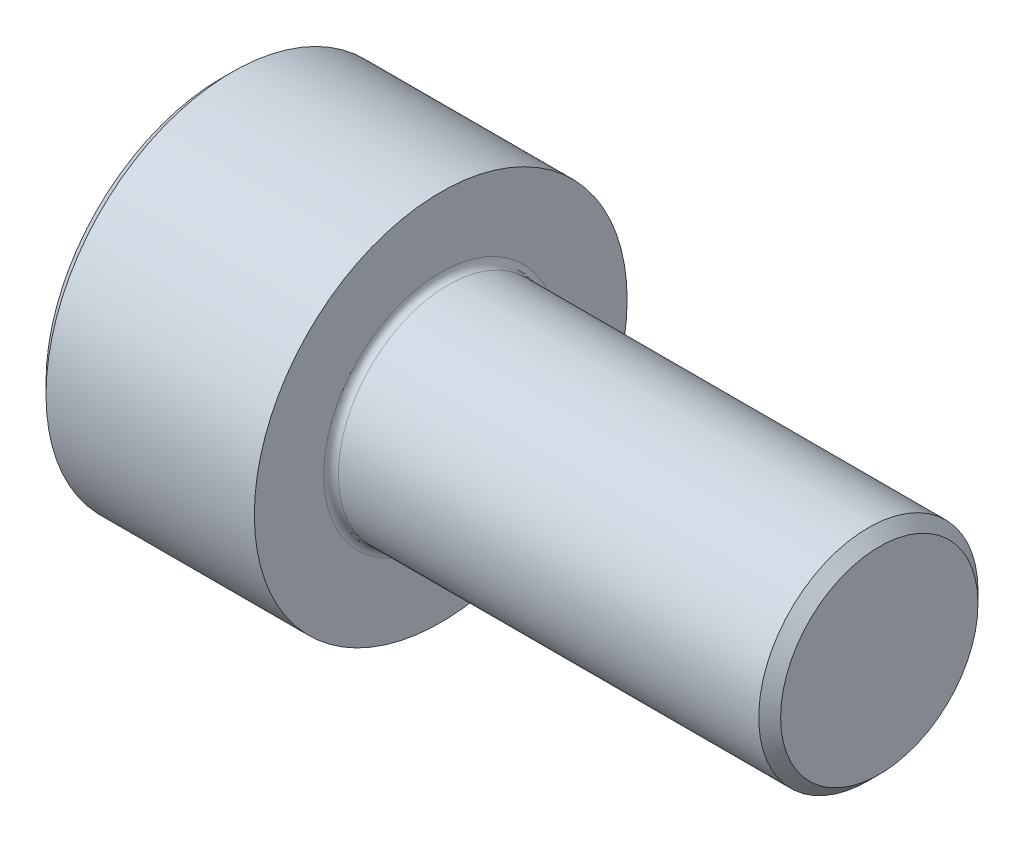
ISO-10303-21;
HEADER;
FILE_DESCRIPTION(('STEP AP214'),'2;1');
FILE_NAME('part.step','',(''),(''),'','','');
FILE_SCHEMA(('AUTOMOTIVE_DESIGN { 1 0 10303 214 1 1 1 1 }'));
ENDSEC;
DATA;
#1=APPLICATION_CONTEXT('core data for automotive mechanical design processes');
#2=APPLICATION_PROTOCOL_DEFINITION('international standard','automotive_design',2000,#1);
#3=PRODUCT_CONTEXT('',#1,'mechanical');
#4=PRODUCT('Part','Part','',(#3));
#5=PRODUCT_RELATED_PRODUCT_CATEGORY('part','',(#4));
#6=PRODUCT_DEFINITION_FORMATION('','',#4);
#7=PRODUCT_DEFINITION_CONTEXT('part definition',#1,'design');
#8=PRODUCT_DEFINITION('design','',#6,#7);
#9=PRODUCT_DEFINITION_SHAPE('','',#8);
#10=(LENGTH_UNIT() NAMED_UNIT(*) SI_UNIT(.MILLI.,.METRE.));
#11=(NAMED_UNIT(*) PLANE_ANGLE_UNIT() SI_UNIT($,.RADIAN.));
#12=(NAMED_UNIT(*) SI_UNIT($,.STERADIAN.) SOLID_ANGLE_UNIT());
#13=UNCERTAINTY_MEASURE_WITH_UNIT(LENGTH_MEASURE(1.E-05),#10,'distance_accuracy_value','');
#14=(GEOMETRIC_REPRESENTATION_CONTEXT(3) GLOBAL_UNCERTAINTY_ASSIGNED_CONTEXT((#13)) GLOBAL_UNIT_ASSIGNED_CONTEXT((#10,
#11,#12)) REPRESENTATION_CONTEXT('',''));
#15=CARTESIAN_POINT('',(0.,0.,0.));
#16=DIRECTION('',(0.,0.,1.));
#17=DIRECTION('',(1.,0.,0.));
#18=AXIS2_PLACEMENT_3D('',#15,#16,#17);
#19=CARTESIAN_POINT('',(6.,0.,0.));
#20=DIRECTION('',(-1.,0.,0.));
#21=DIRECTION('',(0.,0.,1.));
#22=AXIS2_PLACEMENT_3D('',#19,#20,#21);
#23=CYLINDRICAL_SURFACE('',#22,5.1);
#24=CARTESIAN_POINT('',(0.300000000000002,0.,0.));
#25=DIRECTION('',(-1.,0.,0.));
#26=DIRECTION('',(0.,0.,1.));
#27=AXIS2_PLACEMENT_3D('',#24,#25,#26);
#28=CIRCLE('',#27,5.1);
#29=CARTESIAN_POINT('',(0.300000000000002,0.,5.1));
#30=VERTEX_POINT('',#29);
#31=EDGE_CURVE('E178',#30,#30,#28,.F.);
#32=ORIENTED_EDGE('',*,*,#31,.T.);
#33=EDGE_LOOP('',(#32));
#34=FACE_BOUND('',#33,.T.);
#35=CARTESIAN_POINT('',(6.,0.,0.));
#36=DIRECTION('',(-1.,0.,0.));
#37=DIRECTION('',(0.,0.,1.));
#38=AXIS2_PLACEMENT_3D('',#35,#36,#37);
#39=CIRCLE('',#38,5.1);
#40=CARTESIAN_POINT('',(6.,0.,5.1));
#41=VERTEX_POINT('',#40);
#42=EDGE_CURVE('E160',#41,#41,#39,.T.);
#43=ORIENTED_EDGE('',*,*,#42,.T.);
#44=EDGE_LOOP('',(#43));
#45=FACE_BOUND('',#44,.T.);
#46=ADVANCED_FACE('F44',(#34,#45),#23,.T.);
#47=CARTESIAN_POINT('',(6.,5.1,0.));
#48=DIRECTION('',(1.,0.,0.));
#49=DIRECTION('',(0.,0.,-1.));
#50=AXIS2_PLACEMENT_3D('',#47,#48,#49);
#51=PLANE('',#50);
#52=CARTESIAN_POINT('',(6.,0.,0.));
#53=DIRECTION('',(1.,0.,0.));
#54=DIRECTION('',(0.,0.,-1.));
#55=AXIS2_PLACEMENT_3D('',#52,#53,#54);
#56=CIRCLE('',#55,3.2);
#57=CARTESIAN_POINT('',(6.,0.,-3.2));
#58=VERTEX_POINT('',#57);
#59=EDGE_CURVE('E59',#58,#58,#56,.F.);
#60=ORIENTED_EDGE('',*,*,#59,.T.);
#61=EDGE_LOOP('',(#60));
#62=FACE_BOUND('',#61,.T.);
#63=ORIENTED_EDGE('',*,*,#42,.F.);
#64=EDGE_LOOP('',(#63));
#65=FACE_BOUND('',#64,.T.);
#66=ADVANCED_FACE('F190',(#62,#65),#51,.T.);
#67=CARTESIAN_POINT('',(0.,0.,0.));
#68=DIRECTION('',(-1.,0.,0.));
#69=DIRECTION('',(0.,0.,1.));
#70=AXIS2_PLACEMENT_3D('',#67,#68,#69);
#71=PLANE('',#70);
#72=CARTESIAN_POINT('',(0.,0.,0.));
#73=DIRECTION('',(-1.,0.,0.));
#74=DIRECTION('',(0.,0.,1.));
#75=AXIS2_PLACEMENT_3D('',#72,#73,#74);
#76=CIRCLE('',#75,2.945);
#77=CARTESIAN_POINT('',(0.,0.,2.945));
#78=VERTEX_POINT('',#77);
#79=EDGE_CURVE('E240',#78,#78,#76,.T.);
#80=ORIENTED_EDGE('',*,*,#79,.F.);
#81=EDGE_LOOP('',(#80));
#82=FACE_BOUND('',#81,.T.);
#83=CARTESIAN_POINT('',(0.,0.,0.));
#84=DIRECTION('',(-1.,0.,0.));
#85=DIRECTION('',(0.,0.,1.));
#86=AXIS2_PLACEMENT_3D('',#83,#84,#85);
#87=CIRCLE('',#86,4.8);
#88=CARTESIAN_POINT('',(0.,0.,4.8));
#89=VERTEX_POINT('',#88);
#90=EDGE_CURVE('E174',#89,#89,#87,.T.);
#91=ORIENTED_EDGE('',*,*,#90,.T.);
#92=EDGE_LOOP('',(#91));
#93=FACE_BOUND('',#92,.T.);
#94=ADVANCED_FACE('F202',(#82,#93),#71,.T.);
#95=CARTESIAN_POINT('',(18.,0.,0.));
#96=DIRECTION('',(-1.,0.,0.));
#97=DIRECTION('',(0.,0.,1.));
#98=AXIS2_PLACEMENT_3D('',#95,#96,#97);
#99=CYLINDRICAL_SURFACE('',#98,3.);
#100=CARTESIAN_POINT('',(6.2,0.,0.));
#101=DIRECTION('',(1.,0.,0.));
#102=DIRECTION('',(0.,0.,-1.));
#103=AXIS2_PLACEMENT_3D('',#100,#101,#102);
#104=CIRCLE('',#103,3.);
#105=CARTESIAN_POINT('',(6.2,0.,-3.));
#106=VERTEX_POINT('',#105);
#107=EDGE_CURVE('E182',#106,#106,#104,.T.);
#108=ORIENTED_EDGE('',*,*,#107,.T.);
#109=EDGE_LOOP('',(#108));
#110=FACE_BOUND('',#109,.T.);
#111=CARTESIAN_POINT('',(17.7,0.,0.));
#112=DIRECTION('',(1.,0.,0.));
#113=DIRECTION('',(0.,0.,-1.));
#114=AXIS2_PLACEMENT_3D('',#111,#112,#113);
#115=CIRCLE('',#114,3.);
#116=CARTESIAN_POINT('',(17.7,0.,-3.));
#117=VERTEX_POINT('',#116);
#118=EDGE_CURVE('E169',#117,#117,#115,.F.);
#119=ORIENTED_EDGE('',*,*,#118,.T.);
#120=EDGE_LOOP('',(#119));
#121=FACE_BOUND('',#120,.T.);
#122=ADVANCED_FACE('F198',(#110,#121),#99,.T.);
#123=CARTESIAN_POINT('',(18.,0.,0.));
#124=DIRECTION('',(1.,0.,0.));
#125=DIRECTION('',(0.,0.,-1.));
#126=AXIS2_PLACEMENT_3D('',#123,#124,#125);
#127=PLANE('',#126);
#128=CARTESIAN_POINT('',(18.,0.,0.));
#129=DIRECTION('',(1.,0.,0.));
#130=DIRECTION('',(0.,0.,-1.));
#131=AXIS2_PLACEMENT_3D('',#128,#129,#130);
#132=CIRCLE('',#131,2.7);
#133=CARTESIAN_POINT('',(18.,0.,-2.7));
#134=VERTEX_POINT('',#133);
#135=EDGE_CURVE('E165',#134,#134,#132,.T.);
#136=ORIENTED_EDGE('',*,*,#135,.T.);
#137=EDGE_LOOP('',(#136));
#138=FACE_BOUND('',#137,.T.);
#139=ADVANCED_FACE('F201',(#138),#127,.T.);
#140=CARTESIAN_POINT('',(18.,0.,0.));
#141=DIRECTION('',(-1.,0.,0.));
#142=DIRECTION('',(0.,0.,1.));
#143=AXIS2_PLACEMENT_3D('',#140,#141,#142);
#144=CONICAL_SURFACE('',#143,2.7,0.78539816339745);
#145=ORIENTED_EDGE('',*,*,#118,.F.);
#146=EDGE_LOOP('',(#145));
#147=FACE_BOUND('',#146,.T.);
#148=ORIENTED_EDGE('',*,*,#135,.F.);
#149=EDGE_LOOP('',(#148));
#150=FACE_BOUND('',#149,.T.);
#151=ADVANCED_FACE('F206',(#147,#150),#144,.T.);
#152=CARTESIAN_POINT('',(0.,0.,0.));
#153=DIRECTION('',(1.,0.,0.));
#154=DIRECTION('',(0.,0.,-1.));
#155=AXIS2_PLACEMENT_3D('',#152,#153,#154);
#156=CONICAL_SURFACE('',#155,4.8,0.785398163397445);
#157=ORIENTED_EDGE('',*,*,#31,.F.);
#158=EDGE_LOOP('',(#157));
#159=FACE_BOUND('',#158,.T.);
#160=ORIENTED_EDGE('',*,*,#90,.F.);
#161=EDGE_LOOP('',(#160));
#162=FACE_BOUND('',#161,.T.);
#163=ADVANCED_FACE('F195',(#159,#162),#156,.T.);
#164=CARTESIAN_POINT('',(6.2,0.,0.));
#165=DIRECTION('',(1.,0.,0.));
#166=DIRECTION('',(0.,0.,-1.));
#167=AXIS2_PLACEMENT_3D('',#164,#165,#166);
#168=TOROIDAL_SURFACE('',#167,3.2,0.2);
#169=ORIENTED_EDGE('',*,*,#59,.F.);
#170=EDGE_LOOP('',(#169));
#171=FACE_BOUND('',#170,.T.);
#172=ORIENTED_EDGE('',*,*,#107,.F.);
#173=EDGE_LOOP('',(#172));
#174=FACE_BOUND('',#173,.T.);
#175=ADVANCED_FACE('F46',(#171,#174),#168,.F.);
#176=CARTESIAN_POINT('',(1.70029654276345,0.,0.));
#177=DIRECTION('',(-1.,0.,0.));
#178=DIRECTION('',(0.,0.,1.));
#179=AXIS2_PLACEMENT_3D('',#176,#177,#178);
#180=CONICAL_SURFACE('',#179,0.,1.0471975511966);
#181=ORIENTED_EDGE('',*,*,#79,.T.);
#182=EDGE_LOOP('',(#181));
#183=FACE_BOUND('',#182,.T.);
#184=CARTESIAN_POINT('',(0.000229872175366299,2.94460184292093,-0.000199999999999841));
#185=CARTESIAN_POINT('',(0.037598527799728,2.87990372238667,0.111860431919559));
#186=CARTESIAN_POINT('',(0.071584200644194,2.81464713289884,0.224888160441135));
#187=CARTESIAN_POINT('',(0.130907091295653,2.68300392088697,0.45290089211726));
#188=CARTESIAN_POINT('',(0.156223321882847,2.61661495890253,0.567889947336069));
#189=CARTESIAN_POINT('',(0.195632486124268,2.4846598185806,0.796442954693535));
#190=CARTESIAN_POINT('',(0.209987695662893,2.41911394548053,0.909971737129315));
#191=CARTESIAN_POINT('',(0.227126154979493,2.28771371615578,1.13756361044599));
#192=CARTESIAN_POINT('',(0.229923595480082,2.22185983767203,1.25162587385531));
#193=CARTESIAN_POINT('',(0.224110119241172,2.09880371081117,1.46476533776095));
#194=CARTESIAN_POINT('',(0.216926609971056,2.04158305994987,1.56387441229489));
#195=CARTESIAN_POINT('',(0.194157184817385,1.92751455798909,1.76144685323423));
#196=CARTESIAN_POINT('',(0.178563487647654,1.87066710155663,1.85990953605631));
#197=CARTESIAN_POINT('',(0.139579696785724,1.75636333035744,2.05788947527003));
#198=CARTESIAN_POINT('',(0.116024319293374,1.69892148572534,2.15738166865331));
#199=CARTESIAN_POINT('',(0.0625625859029028,1.58489462646657,2.35488198231701));
#200=CARTESIAN_POINT('',(0.0326687951749982,1.52830815049912,2.4528926337139));
#201=CARTESIAN_POINT('',(0.000229872175367198,1.47212771637971,2.5502));
#202=B_SPLINE_CURVE_WITH_KNOTS('',3,(#184,#185,#186,#187,#188,#189,#190,#191,#192,#193,#194,
#195,#196,#197,#198,#199,#200,#201),.UNSPECIFIED.,.F.,.F.,(4,2,2,2,2,2,2,2,4),(0.,
0.40421122763369,0.809394175542334,1.20454855862244,1.59921762349791,1.94289011245202,
2.28688112141386,2.63850335588813,2.98943495034801),.UNSPECIFIED.);
#203=CARTESIAN_POINT('',(0.000296542763447859,2.94448637286709,0.));
#204=VERTEX_POINT('',#203);
#205=CARTESIAN_POINT('',(0.000296542763448576,1.47224318643355,2.55));
#206=VERTEX_POINT('',#205);
#207=EDGE_CURVE('E123',#204,#206,#202,.T.);
#208=ORIENTED_EDGE('',*,*,#207,.T.);
#209=CARTESIAN_POINT('',(-1.47484899769549,4.87259146751385,2.55));
#210=CARTESIAN_POINT('',(-1.41648166165182,4.75847328617427,2.55));
#211=CARTESIAN_POINT('',(-1.3584508479649,4.64418140763559,2.55));
#212=CARTESIAN_POINT('',(-1.24323009027991,4.41517179068526,2.55));
#213=CARTESIAN_POINT('',(-1.18604016418326,4.30045404327233,2.55));
#214=CARTESIAN_POINT('',(-1.07257438035036,4.07032208462447,2.55));
#215=CARTESIAN_POINT('',(-1.01630025665971,3.95490701685364,2.55));
#216=CARTESIAN_POINT('',(-0.904997025129718,3.72347505526788,2.55));
#217=CARTESIAN_POINT('',(-0.849967935476552,3.60745815269235,2.55));
#218=CARTESIAN_POINT('',(-0.738687224935464,3.36877341251939,2.55));
#219=CARTESIAN_POINT('',(-0.682516181725843,3.24606789662205,2.55));
#220=CARTESIAN_POINT('',(-0.572335768770349,2.9996911005209,2.55));
#221=CARTESIAN_POINT('',(-0.518326336906287,2.87601984819167,2.55));
#222=CARTESIAN_POINT('',(-0.413117941821226,2.62758289647777,2.55));
#223=CARTESIAN_POINT('',(-0.361917038751132,2.50281802333484,2.55));
#224=CARTESIAN_POINT('',(-0.26310393155866,2.25183291867401,2.55));
#225=CARTESIAN_POINT('',(-0.215492605547942,2.12561233970017,2.55));
#226=CARTESIAN_POINT('',(-0.116904477360082,1.84880230520432,2.55));
#227=CARTESIAN_POINT('',(-0.0668420529179473,1.6978818109477,2.55));
#228=CARTESIAN_POINT('',(0.0242806527338532,1.39338628644286,2.55));
#229=CARTESIAN_POINT('',(0.0653456833257317,1.2398127030735,2.55));
#230=CARTESIAN_POINT('',(0.134735280374326,0.932707548207137,2.55));
#231=CARTESIAN_POINT('',(0.163282863336434,0.779228452500968,2.55));
#232=CARTESIAN_POINT('',(0.195121536659108,0.547542325977293,2.55));
#233=CARTESIAN_POINT('',(0.203903693213269,0.470075790207209,2.55));
#234=CARTESIAN_POINT('',(0.217537764667609,0.314802075382786,2.55));
#235=CARTESIAN_POINT('',(0.222390252945671,0.236994947690502,2.55));
#236=CARTESIAN_POINT('',(0.22802291270262,0.0803147315579719,2.55));
#237=CARTESIAN_POINT('',(0.228754521003386,0.00143986825860558,2.55));
#238=CARTESIAN_POINT('',(0.225996296141731,-0.156230083236554,2.55));
#239=CARTESIAN_POINT('',(0.222506449125209,-0.235025171169688,2.55));
#240=CARTESIAN_POINT('',(0.205854624492048,-0.471007687663784,2.55));
#241=CARTESIAN_POINT('',(0.186510158289658,-0.627786337743065,2.55));
#242=CARTESIAN_POINT('',(0.133287319024384,-0.941901112470843,2.55));
#243=CARTESIAN_POINT('',(0.0991310864492806,-1.0991877624398,2.55));
#244=CARTESIAN_POINT('',(0.0196702729838235,-1.41088610410001,2.55));
#245=CARTESIAN_POINT('',(-0.0256368739949201,-1.56529712523093,2.55));
#246=CARTESIAN_POINT('',(-0.120424779152049,-1.85908383984755,2.55));
#247=CARTESIAN_POINT('',(-0.169273879242653,-1.9986674687844,2.55));
#248=CARTESIAN_POINT('',(-0.272107483202157,-2.27594397293141,2.55));
#249=CARTESIAN_POINT('',(-0.326093002031515,-2.41363646827513,2.55));
#250=CARTESIAN_POINT('',(-0.437938442919878,-2.68756852985751,2.55));
#251=CARTESIAN_POINT('',(-0.495801747180723,-2.82380670436804,2.55));
#252=CARTESIAN_POINT('',(-0.614424878596883,-3.09501779074027,2.55));
#253=CARTESIAN_POINT('',(-0.675184845718758,-3.22999064108373,2.55));
#254=CARTESIAN_POINT('',(-0.795625795555528,-3.4917459180872,2.55));
#255=CARTESIAN_POINT('',(-0.855191713287153,-3.61858149439616,2.55));
#256=CARTESIAN_POINT('',(-0.975894547973628,-3.87150571223176,2.55));
#257=CARTESIAN_POINT('',(-1.03703150898513,-3.99759433268931,2.55));
#258=CARTESIAN_POINT('',(-1.160378776672,-4.24879428314627,2.55));
#259=CARTESIAN_POINT('',(-1.22258549181428,-4.37390738071277,2.55));
#260=CARTESIAN_POINT('',(-1.34801235978549,-4.62361247945631,2.55));
#261=CARTESIAN_POINT('',(-1.41123243171126,-4.74820452124121,2.55));
#262=CARTESIAN_POINT('',(-1.47484899769549,-4.87259146751385,2.55));
#263=B_SPLINE_CURVE_WITH_KNOTS('',3,(#209,#210,#211,#212,#213,#214,#215,#216,#217,#218,#219,
#220,#221,#222,#223,#224,#225,#226,#227,#228,#229,#230,#231,#232,#233,#234,#235,#236,#237,#238,
#239,#240,#241,#242,#243,#244,#245,#246,#247,#248,#249,#250,#251,#252,#253,#254,#255,#256,#257,
#258,#259,#260,#261,#262),.UNSPECIFIED.,.F.,.F.,(4,2,2,2,2,2,2,2,2,2,2,2,2,2,2,2,2,2,2,2,2,2,2,
2,2,2,4),(0.,0.384536769578632,0.76908171364089,1.15428553221106,1.53949497381647,
1.94433219747402,2.34915777896561,2.75370013269541,3.15834112992183,3.63515445320083,
4.1117154752074,4.57940180494931,4.81320458962684,5.04697325399144,5.28349112970923,
5.52000978164074,5.99306509581475,6.47540693422917,6.95785987483154,7.40138788087398,
7.84500371114791,8.28901162934102,8.73304102375602,9.15340673889058,9.57378425520128,
9.99295308905535,10.4120886228657),.UNSPECIFIED.);
#264=CARTESIAN_POINT('',(0.000296542763448674,-1.47224318643355,2.55));
#265=VERTEX_POINT('',#264);
#266=EDGE_CURVE('E140',#206,#265,#263,.T.);
#267=ORIENTED_EDGE('',*,*,#266,.T.);
#268=CARTESIAN_POINT('',(0.000229872175366992,-1.47212771637971,2.5502));
#269=CARTESIAN_POINT('',(0.0375985277997286,-1.53682583691397,2.43813956808044));
#270=CARTESIAN_POINT('',(0.0715842006441946,-1.6020824264018,2.32511183955886));
#271=CARTESIAN_POINT('',(0.130907091295654,-1.73372563841367,2.09709910788274));
#272=CARTESIAN_POINT('',(0.156223321882848,-1.80011460039811,1.98211005266393));
#273=CARTESIAN_POINT('',(0.195632486124269,-1.93206974072004,1.75355704530646));
#274=CARTESIAN_POINT('',(0.209987695662893,-1.99761561382011,1.64002826287068));
#275=CARTESIAN_POINT('',(0.227126154979493,-2.12901584314486,1.41243638955401));
#276=CARTESIAN_POINT('',(0.229923595480083,-2.19486972162861,1.29837412614469));
#277=CARTESIAN_POINT('',(0.224110119241172,-2.31792584848947,1.08523466223905));
#278=CARTESIAN_POINT('',(0.216926609971057,-2.37514649935077,0.986125587705114));
#279=CARTESIAN_POINT('',(0.194157184817386,-2.48921500131155,0.788553146765766));
#280=CARTESIAN_POINT('',(0.178563487647654,-2.54606245774401,0.690090463943686));
#281=CARTESIAN_POINT('',(0.139579696785724,-2.6603662289432,0.492110524729967));
#282=CARTESIAN_POINT('',(0.116024319293374,-2.7178080735753,0.392618331346692));
#283=CARTESIAN_POINT('',(0.0625625859029027,-2.83183493283407,0.19511801768299));
#284=CARTESIAN_POINT('',(0.032668795174998,-2.88842140880151,0.0971073662861024));
#285=CARTESIAN_POINT('',(0.000229872175366889,-2.94460184292093,-0.000200000000000605));
#286=B_SPLINE_CURVE_WITH_KNOTS('',3,(#268,#269,#270,#271,#272,#273,#274,#275,#276,#277,#278,
#279,#280,#281,#282,#283,#284,#285),.UNSPECIFIED.,.F.,.F.,(4,2,2,2,2,2,2,2,4),(0.,
0.404211227633689,0.809394175542333,1.20454855862244,1.59921762349791,1.94289011245202,
2.28688112141386,2.63850335588813,2.98943495034801),.UNSPECIFIED.);
#287=CARTESIAN_POINT('',(0.000296542763448496,-2.94448637286709,0.));
#288=VERTEX_POINT('',#287);
#289=EDGE_CURVE('E272',#265,#288,#286,.T.);
#290=ORIENTED_EDGE('',*,*,#289,.T.);
#291=CARTESIAN_POINT('',(0.000229872175367005,-2.94460184292093,0.000199999999999544));
#292=CARTESIAN_POINT('',(0.0375985277997286,-2.87990372238667,-0.111860431919559));
#293=CARTESIAN_POINT('',(0.0715842006441947,-2.81464713289884,-0.224888160441135));
#294=CARTESIAN_POINT('',(0.130907091295654,-2.68300392088697,-0.452900892117259));
#295=CARTESIAN_POINT('',(0.156223321882848,-2.61661495890253,-0.567889947336069));
#296=CARTESIAN_POINT('',(0.195632486124269,-2.4846598185806,-0.796442954693535));
#297=CARTESIAN_POINT('',(0.209987695662893,-2.41911394548053,-0.909971737129315));
#298=CARTESIAN_POINT('',(0.227126154979493,-2.28771371615578,-1.13756361044599));
#299=CARTESIAN_POINT('',(0.229923595480083,-2.22185983767203,-1.25162587385531));
#300=CARTESIAN_POINT('',(0.224110119241172,-2.09880371081117,-1.46476533776095));
#301=CARTESIAN_POINT('',(0.216926609971056,-2.04158305994987,-1.56387441229489));
#302=CARTESIAN_POINT('',(0.194157184817385,-1.92751455798909,-1.76144685323423));
#303=CARTESIAN_POINT('',(0.178563487647654,-1.87066710155663,-1.85990953605631));
#304=CARTESIAN_POINT('',(0.139579696785724,-1.75636333035744,-2.05788947527003));
#305=CARTESIAN_POINT('',(0.116024319293373,-1.69892148572534,-2.15738166865331));
#306=CARTESIAN_POINT('',(0.0625625859029021,-1.58489462646657,-2.35488198231701));
#307=CARTESIAN_POINT('',(0.0326687951749973,-1.52830815049912,-2.4528926337139));
#308=CARTESIAN_POINT('',(0.000229872175366292,-1.47212771637971,-2.5502));
#309=B_SPLINE_CURVE_WITH_KNOTS('',3,(#291,#292,#293,#294,#295,#296,#297,#298,#299,#300,#301,
#302,#303,#304,#305,#306,#307,#308),.UNSPECIFIED.,.F.,.F.,(4,2,2,2,2,2,2,2,4),(0.,
0.40421122763369,0.809394175542334,1.20454855862244,1.59921762349791,1.94289011245202,
2.28688112141386,2.63850335588814,2.98943495034801),.UNSPECIFIED.);
#310=CARTESIAN_POINT('',(0.00029654276344784,-1.47224318643355,-2.55));
#311=VERTEX_POINT('',#310);
#312=EDGE_CURVE('E246',#288,#311,#309,.T.);
#313=ORIENTED_EDGE('',*,*,#312,.T.);
#314=CARTESIAN_POINT('',(-1.47484899769549,-4.87259146751385,-2.55));
#315=CARTESIAN_POINT('',(-1.41648166165182,-4.75847328617427,-2.55));
#316=CARTESIAN_POINT('',(-1.3584508479649,-4.64418140763558,-2.55));
#317=CARTESIAN_POINT('',(-1.24323009027991,-4.41517179068526,-2.55));
#318=CARTESIAN_POINT('',(-1.18604016418326,-4.30045404327233,-2.55));
#319=CARTESIAN_POINT('',(-1.07257438035036,-4.07032208462447,-2.55));
#320=CARTESIAN_POINT('',(-1.01630025665971,-3.95490701685364,-2.55));
#321=CARTESIAN_POINT('',(-0.904997025129717,-3.72347505526788,-2.55));
#322=CARTESIAN_POINT('',(-0.849967935476551,-3.60745815269235,-2.55));
#323=CARTESIAN_POINT('',(-0.738687224935463,-3.36877341251938,-2.55));
#324=CARTESIAN_POINT('',(-0.682516181725842,-3.24606789662205,-2.55));
#325=CARTESIAN_POINT('',(-0.572335768770349,-2.99969110052089,-2.55));
#326=CARTESIAN_POINT('',(-0.518326336906287,-2.87601984819166,-2.55));
#327=CARTESIAN_POINT('',(-0.413117941821226,-2.62758289647777,-2.55));
#328=CARTESIAN_POINT('',(-0.361917038751133,-2.50281802333484,-2.55));
#329=CARTESIAN_POINT('',(-0.26310393155866,-2.25183291867401,-2.55));
#330=CARTESIAN_POINT('',(-0.215492605547942,-2.12561233970017,-2.55));
#331=CARTESIAN_POINT('',(-0.116904477360083,-1.84880230520432,-2.55));
#332=CARTESIAN_POINT('',(-0.0668420529179478,-1.6978818109477,-2.55));
#333=CARTESIAN_POINT('',(0.0242806527338525,-1.39338628644286,-2.55));
#334=CARTESIAN_POINT('',(0.0653456833257307,-1.2398127030735,-2.55));
#335=CARTESIAN_POINT('',(0.134735280374325,-0.932707548207135,-2.55));
#336=CARTESIAN_POINT('',(0.163282863336433,-0.779228452500966,-2.55));
#337=CARTESIAN_POINT('',(0.195121536659108,-0.54754232597729,-2.55));
#338=CARTESIAN_POINT('',(0.203903693213268,-0.470075790207207,-2.55));
#339=CARTESIAN_POINT('',(0.217537764667608,-0.314802075382784,-2.55));
#340=CARTESIAN_POINT('',(0.22239025294567,-0.2369949476905,-2.55));
#341=CARTESIAN_POINT('',(0.228022912702619,-0.0803147315579691,-2.55));
#342=CARTESIAN_POINT('',(0.228754521003385,-0.00143986825860244,-2.55));
#343=CARTESIAN_POINT('',(0.22599629614173,0.156230083236557,-2.55));
#344=CARTESIAN_POINT('',(0.222506449125207,0.235025171169692,-2.55));
#345=CARTESIAN_POINT('',(0.205854624492046,0.471007687663788,-2.55));
#346=CARTESIAN_POINT('',(0.186510158289656,0.627786337743068,-2.55));
#347=CARTESIAN_POINT('',(0.133287319024382,0.941901112470846,-2.55));
#348=CARTESIAN_POINT('',(0.0991310864492786,1.09918776243981,-2.55));
#349=CARTESIAN_POINT('',(0.0196702729838215,1.41088610410002,-2.55));
#350=CARTESIAN_POINT('',(-0.0256368739949221,1.56529712523093,-2.55));
#351=CARTESIAN_POINT('',(-0.12042477915205,1.85908383984755,-2.55));
#352=CARTESIAN_POINT('',(-0.169273879242655,1.99866746878441,-2.55));
#353=CARTESIAN_POINT('',(-0.272107483202158,2.27594397293141,-2.55));
#354=CARTESIAN_POINT('',(-0.326093002031517,2.41363646827514,-2.55));
#355=CARTESIAN_POINT('',(-0.437938442919879,2.68756852985751,-2.55));
#356=CARTESIAN_POINT('',(-0.495801747180725,2.82380670436804,-2.55));
#357=CARTESIAN_POINT('',(-0.614424878596884,3.09501779074027,-2.55));
#358=CARTESIAN_POINT('',(-0.675184845718758,3.22999064108373,-2.55));
#359=CARTESIAN_POINT('',(-0.795625795555528,3.4917459180872,-2.55));
#360=CARTESIAN_POINT('',(-0.855191713287153,3.61858149439616,-2.55));
#361=CARTESIAN_POINT('',(-0.975894547973629,3.87150571223176,-2.55));
#362=CARTESIAN_POINT('',(-1.03703150898513,3.9975943326893,-2.55));
#363=CARTESIAN_POINT('',(-1.160378776672,4.24879428314627,-2.55));
#364=CARTESIAN_POINT('',(-1.22258549181429,4.37390738071277,-2.55));
#365=CARTESIAN_POINT('',(-1.34801235978549,4.62361247945631,-2.55));
#366=CARTESIAN_POINT('',(-1.41123243171126,4.74820452124121,-2.55));
#367=CARTESIAN_POINT('',(-1.47484899769549,4.87259146751385,-2.55));
#368=B_SPLINE_CURVE_WITH_KNOTS('',3,(#314,#315,#316,#317,#318,#319,#320,#321,#322,#323,#324,
#325,#326,#327,#328,#329,#330,#331,#332,#333,#334,#335,#336,#337,#338,#339,#340,#341,#342,#343,
#344,#345,#346,#347,#348,#349,#350,#351,#352,#353,#354,#355,#356,#357,#358,#359,#360,#361,#362,
#363,#364,#365,#366,#367),.UNSPECIFIED.,.F.,.F.,(4,2,2,2,2,2,2,2,2,2,2,2,2,2,2,2,2,2,2,2,2,2,2,
2,2,2,4),(0.,0.384536769578632,0.769081713640891,1.15428553221106,1.53949497381647,
1.94433219747402,2.3491577789656,2.75370013269541,3.15834112992183,3.63515445320083,
4.1117154752074,4.57940180494931,4.81320458962684,5.04697325399144,5.28349112970923,
5.52000978164074,5.99306509581475,6.47540693422917,6.95785987483154,7.40138788087398,
7.84500371114791,8.28901162934102,8.73304102375602,9.15340673889057,9.57378425520128,
9.99295308905535,10.4120886228657),.UNSPECIFIED.);
#369=CARTESIAN_POINT('',(0.000296542763447575,1.47224318643355,-2.55));
#370=VERTEX_POINT('',#369);
#371=EDGE_CURVE('E65',#311,#370,#368,.T.);
#372=ORIENTED_EDGE('',*,*,#371,.T.);
#373=CARTESIAN_POINT('',(0.000229872175366143,1.47212771637971,-2.5502));
#374=CARTESIAN_POINT('',(0.0375985277997276,1.53682583691397,-2.43813956808044));
#375=CARTESIAN_POINT('',(0.0715842006441937,1.6020824264018,-2.32511183955886));
#376=CARTESIAN_POINT('',(0.130907091295653,1.73372563841367,-2.09709910788274));
#377=CARTESIAN_POINT('',(0.156223321882847,1.80011460039811,-1.98211005266393));
#378=CARTESIAN_POINT('',(0.195632486124268,1.93206974072004,-1.75355704530647));
#379=CARTESIAN_POINT('',(0.209987695662893,1.99761561382011,-1.64002826287069));
#380=CARTESIAN_POINT('',(0.227126154979493,2.12901584314486,-1.41243638955401));
#381=CARTESIAN_POINT('',(0.229923595480082,2.19486972162861,-1.29837412614469));
#382=CARTESIAN_POINT('',(0.224110119241171,2.31792584848947,-1.08523466223905));
#383=CARTESIAN_POINT('',(0.216926609971056,2.37514649935077,-0.986125587705115));
#384=CARTESIAN_POINT('',(0.194157184817385,2.48921500131155,-0.788553146765766));
#385=CARTESIAN_POINT('',(0.178563487647654,2.54606245774401,-0.690090463943686));
#386=CARTESIAN_POINT('',(0.139579696785724,2.6603662289432,-0.492110524729968));
#387=CARTESIAN_POINT('',(0.116024319293373,2.7178080735753,-0.392618331346692));
#388=CARTESIAN_POINT('',(0.0625625859029024,2.83183493283407,-0.19511801768299));
#389=CARTESIAN_POINT('',(0.0326687951749976,2.88842140880151,-0.0971073662861028));
#390=CARTESIAN_POINT('',(0.000229872175366505,2.94460184292093,0.000200000000000163));
#391=B_SPLINE_CURVE_WITH_KNOTS('',3,(#373,#374,#375,#376,#377,#378,#379,#380,#381,#382,#383,
#384,#385,#386,#387,#388,#389,#390),.UNSPECIFIED.,.F.,.F.,(4,2,2,2,2,2,2,2,4),(0.,
0.40421122763369,0.809394175542334,1.20454855862244,1.59921762349791,1.94289011245202,
2.28688112141386,2.63850335588814,2.98943495034802),.UNSPECIFIED.);
#392=EDGE_CURVE('E11',#370,#204,#391,.T.);
#393=ORIENTED_EDGE('',*,*,#392,.T.);
#394=EDGE_LOOP('',(#208,#267,#290,#313,#372,#393));
#395=FACE_BOUND('',#394,.T.);
#396=ADVANCED_FACE('F122',(#183,#395),#180,.F.);
#397=CARTESIAN_POINT('',(3.97224318643355,0.,0.));
#398=DIRECTION('',(-1.,0.,0.));
#399=DIRECTION('',(0.,-1.,0.));
#400=AXIS2_PLACEMENT_3D('',#397,#398,#399);
#401=CONICAL_SURFACE('',#400,0.,1.0471975511966);
#402=CARTESIAN_POINT('',(2.5,0.,0.));
#403=DIRECTION('',(1.,0.,0.));
#404=DIRECTION('',(0.,1.,0.));
#405=AXIS2_PLACEMENT_3D('',#402,#403,#404);
#406=CIRCLE('',#405,2.55);
#407=CARTESIAN_POINT('',(2.5,2.20836477965032,1.275));
#408=VERTEX_POINT('',#407);
#409=CARTESIAN_POINT('',(2.5,0.,2.55));
#410=VERTEX_POINT('',#409);
#411=EDGE_CURVE('E73',#408,#410,#406,.T.);
#412=ORIENTED_EDGE('',*,*,#411,.F.);
#413=CARTESIAN_POINT('',(2.5,2.20836477965032,-1.275));
#414=VERTEX_POINT('',#413);
#415=EDGE_CURVE('E164',#414,#408,#406,.T.);
#416=ORIENTED_EDGE('',*,*,#415,.F.);
#417=CARTESIAN_POINT('',(2.5,0.,-2.55));
#418=VERTEX_POINT('',#417);
#419=EDGE_CURVE('E362',#418,#414,#406,.T.);
#420=ORIENTED_EDGE('',*,*,#419,.F.);
#421=CARTESIAN_POINT('',(2.5,-2.20836477965032,-1.275));
#422=VERTEX_POINT('',#421);
#423=EDGE_CURVE('E367',#422,#418,#406,.T.);
#424=ORIENTED_EDGE('',*,*,#423,.F.);
#425=CARTESIAN_POINT('',(2.5,-2.20836477965032,1.275));
#426=VERTEX_POINT('',#425);
#427=EDGE_CURVE('E360',#426,#422,#406,.T.);
#428=ORIENTED_EDGE('',*,*,#427,.F.);
#429=EDGE_CURVE('E170',#410,#426,#406,.T.);
#430=ORIENTED_EDGE('',*,*,#429,.F.);
#431=EDGE_LOOP('',(#412,#416,#420,#424,#428,#430));
#432=FACE_BOUND('',#431,.T.);
#433=CARTESIAN_POINT('',(3.97224318643355,0.,0.));
#434=VERTEX_POINT('',#433);
#435=VERTEX_LOOP('',#434);
#436=FACE_BOUND('',#435,.T.);
#437=ADVANCED_FACE('F265',(#432,#436),#401,.F.);
#438=CARTESIAN_POINT('',(2.5,0.,0.));
#439=DIRECTION('',(-1.,0.,0.));
#440=DIRECTION('',(0.,0.,1.));
#441=AXIS2_PLACEMENT_3D('',#438,#439,#440);
#442=PLANE('',#441);
#443=DIRECTION('',(0.,0.5,-0.866025403784439));
#444=VECTOR('',#443,1.);
#445=CARTESIAN_POINT('',(2.5,1.47224318643355,2.55));
#446=LINE('',#445,#444);
#447=CARTESIAN_POINT('',(2.5,1.47224318643355,2.55));
#448=VERTEX_POINT('',#447);
#449=EDGE_CURVE('E349',#448,#408,#446,.T.);
#450=ORIENTED_EDGE('',*,*,#449,.T.);
#451=ORIENTED_EDGE('',*,*,#411,.T.);
#452=DIRECTION('',(0.,1.,0.));
#453=VECTOR('',#452,1.);
#454=CARTESIAN_POINT('',(2.5,-1.47224318643355,2.55));
#455=LINE('',#454,#453);
#456=EDGE_CURVE('E156',#410,#448,#455,.T.);
#457=ORIENTED_EDGE('',*,*,#456,.T.);
#458=EDGE_LOOP('',(#450,#451,#457));
#459=FACE_BOUND('',#458,.T.);
#460=ADVANCED_FACE('F385',(#459),#442,.T.);
#461=CARTESIAN_POINT('',(2.5,-1.47224318643355,2.55));
#462=VERTEX_POINT('',#461);
#463=EDGE_CURVE('E148',#462,#410,#455,.T.);
#464=ORIENTED_EDGE('',*,*,#463,.T.);
#465=ORIENTED_EDGE('',*,*,#429,.T.);
#466=DIRECTION('',(0.,0.5,0.866025403784439));
#467=VECTOR('',#466,1.);
#468=CARTESIAN_POINT('',(2.5,-2.94448637286709,0.));
#469=LINE('',#468,#467);
#470=EDGE_CURVE('E335',#426,#462,#469,.T.);
#471=ORIENTED_EDGE('',*,*,#470,.T.);
#472=EDGE_LOOP('',(#464,#465,#471));
#473=FACE_BOUND('',#472,.T.);
#474=ADVANCED_FACE('F408',(#473),#442,.T.);
#475=CARTESIAN_POINT('',(2.5,-2.94448637286709,0.));
#476=VERTEX_POINT('',#475);
#477=EDGE_CURVE('E322',#476,#426,#469,.T.);
#478=ORIENTED_EDGE('',*,*,#477,.T.);
#479=ORIENTED_EDGE('',*,*,#427,.T.);
#480=DIRECTION('',(0.,-0.5,0.866025403784439));
#481=VECTOR('',#480,1.);
#482=CARTESIAN_POINT('',(2.5,-1.47224318643355,-2.55));
#483=LINE('',#482,#481);
#484=EDGE_CURVE('E340',#422,#476,#483,.T.);
#485=ORIENTED_EDGE('',*,*,#484,.T.);
#486=EDGE_LOOP('',(#478,#479,#485));
#487=FACE_BOUND('',#486,.T.);
#488=ADVANCED_FACE('F379',(#487),#442,.T.);
#489=CARTESIAN_POINT('',(2.5,-1.47224318643355,-2.55));
#490=VERTEX_POINT('',#489);
#491=EDGE_CURVE('E336',#490,#422,#483,.T.);
#492=ORIENTED_EDGE('',*,*,#491,.T.);
#493=ORIENTED_EDGE('',*,*,#423,.T.);
#494=DIRECTION('',(0.,-1.,0.));
#495=VECTOR('',#494,1.);
#496=CARTESIAN_POINT('',(2.5,1.47224318643355,-2.55));
#497=LINE('',#496,#495);
#498=EDGE_CURVE('E345',#418,#490,#497,.T.);
#499=ORIENTED_EDGE('',*,*,#498,.T.);
#500=EDGE_LOOP('',(#492,#493,#499));
#501=FACE_BOUND('',#500,.T.);
#502=ADVANCED_FACE('F381',(#501),#442,.T.);
#503=DIRECTION('',(0.,-0.5,-0.866025403784439));
#504=VECTOR('',#503,1.);
#505=CARTESIAN_POINT('',(2.5,2.94448637286709,0.));
#506=LINE('',#505,#504);
#507=CARTESIAN_POINT('',(2.5,2.94448637286709,0.));
#508=VERTEX_POINT('',#507);
#509=EDGE_CURVE('E145',#508,#414,#506,.T.);
#510=ORIENTED_EDGE('',*,*,#509,.T.);
#511=ORIENTED_EDGE('',*,*,#415,.T.);
#512=EDGE_CURVE('E352',#408,#508,#446,.T.);
#513=ORIENTED_EDGE('',*,*,#512,.T.);
#514=EDGE_LOOP('',(#510,#511,#513));
#515=FACE_BOUND('',#514,.T.);
#516=ADVANCED_FACE('F295',(#515),#442,.T.);
#517=CARTESIAN_POINT('',(2.5,1.47224318643355,-2.55));
#518=VERTEX_POINT('',#517);
#519=EDGE_CURVE('E341',#518,#418,#497,.T.);
#520=ORIENTED_EDGE('',*,*,#519,.T.);
#521=ORIENTED_EDGE('',*,*,#419,.T.);
#522=EDGE_CURVE('E348',#414,#518,#506,.T.);
#523=ORIENTED_EDGE('',*,*,#522,.T.);
#524=EDGE_LOOP('',(#520,#521,#523));
#525=FACE_BOUND('',#524,.T.);
#526=ADVANCED_FACE('F418',(#525),#442,.T.);
#527=CARTESIAN_POINT('',(2.5,2.94448637286709,0.));
#528=DIRECTION('',(0.,0.866025403784439,-0.5));
#529=DIRECTION('',(0.,0.5,0.866025403784439));
#530=AXIS2_PLACEMENT_3D('',#527,#528,#529);
#531=PLANE('',#530);
#532=ORIENTED_EDGE('',*,*,#392,.F.);
#533=DIRECTION('',(-1.,0.,0.));
#534=VECTOR('',#533,1.);
#535=CARTESIAN_POINT('',(2.5,1.47224318643355,-2.55));
#536=LINE('',#535,#534);
#537=EDGE_CURVE('E147',#518,#370,#536,.T.);
#538=ORIENTED_EDGE('',*,*,#537,.F.);
#539=ORIENTED_EDGE('',*,*,#522,.F.);
#540=ORIENTED_EDGE('',*,*,#509,.F.);
#541=DIRECTION('',(-1.,0.,0.));
#542=VECTOR('',#541,1.);
#543=CARTESIAN_POINT('',(2.5,2.94448637286709,0.));
#544=LINE('',#543,#542);
#545=EDGE_CURVE('E134',#508,#204,#544,.T.);
#546=ORIENTED_EDGE('',*,*,#545,.T.);
#547=EDGE_LOOP('',(#532,#538,#539,#540,#546));
#548=FACE_BOUND('',#547,.T.);
#549=ADVANCED_FACE('F142',(#548),#531,.F.);
#550=CARTESIAN_POINT('',(2.5,1.47224318643355,-2.55));
#551=DIRECTION('',(0.,0.,-1.));
#552=DIRECTION('',(-1.,0.,0.));
#553=AXIS2_PLACEMENT_3D('',#550,#551,#552);
#554=PLANE('',#553);
#555=ORIENTED_EDGE('',*,*,#371,.F.);
#556=DIRECTION('',(-1.,0.,0.));
#557=VECTOR('',#556,1.);
#558=CARTESIAN_POINT('',(2.5,-1.47224318643355,-2.55));
#559=LINE('',#558,#557);
#560=EDGE_CURVE('E153',#490,#311,#559,.T.);
#561=ORIENTED_EDGE('',*,*,#560,.F.);
#562=ORIENTED_EDGE('',*,*,#498,.F.);
#563=ORIENTED_EDGE('',*,*,#519,.F.);
#564=ORIENTED_EDGE('',*,*,#537,.T.);
#565=EDGE_LOOP('',(#555,#561,#562,#563,#564));
#566=FACE_BOUND('',#565,.T.);
#567=ADVANCED_FACE('F260',(#566),#554,.F.);
#568=CARTESIAN_POINT('',(2.5,-1.47224318643355,-2.55));
#569=DIRECTION('',(0.,-0.866025403784439,-0.5));
#570=DIRECTION('',(0.,0.5,-0.866025403784439));
#571=AXIS2_PLACEMENT_3D('',#568,#569,#570);
#572=PLANE('',#571);
#573=ORIENTED_EDGE('',*,*,#312,.F.);
#574=DIRECTION('',(-1.,0.,0.));
#575=VECTOR('',#574,1.);
#576=CARTESIAN_POINT('',(2.5,-2.94448637286709,0.));
#577=LINE('',#576,#575);
#578=EDGE_CURVE('E312',#476,#288,#577,.T.);
#579=ORIENTED_EDGE('',*,*,#578,.F.);
#580=ORIENTED_EDGE('',*,*,#484,.F.);
#581=ORIENTED_EDGE('',*,*,#491,.F.);
#582=ORIENTED_EDGE('',*,*,#560,.T.);
#583=EDGE_LOOP('',(#573,#579,#580,#581,#582));
#584=FACE_BOUND('',#583,.T.);
#585=ADVANCED_FACE('F298',(#584),#572,.F.);
#586=CARTESIAN_POINT('',(2.5,-2.94448637286709,0.));
#587=DIRECTION('',(0.,-0.866025403784439,0.5));
#588=DIRECTION('',(0.,-0.5,-0.866025403784439));
#589=AXIS2_PLACEMENT_3D('',#586,#587,#588);
#590=PLANE('',#589);
#591=ORIENTED_EDGE('',*,*,#289,.F.);
#592=DIRECTION('',(-1.,0.,0.));
#593=VECTOR('',#592,1.);
#594=CARTESIAN_POINT('',(2.5,-1.47224318643355,2.55));
#595=LINE('',#594,#593);
#596=EDGE_CURVE('E324',#462,#265,#595,.T.);
#597=ORIENTED_EDGE('',*,*,#596,.F.);
#598=ORIENTED_EDGE('',*,*,#470,.F.);
#599=ORIENTED_EDGE('',*,*,#477,.F.);
#600=ORIENTED_EDGE('',*,*,#578,.T.);
#601=EDGE_LOOP('',(#591,#597,#598,#599,#600));
#602=FACE_BOUND('',#601,.T.);
#603=ADVANCED_FACE('F293',(#602),#590,.F.);
#604=CARTESIAN_POINT('',(2.5,-1.47224318643355,2.55));
#605=DIRECTION('',(0.,0.,1.));
#606=DIRECTION('',(1.,0.,0.));
#607=AXIS2_PLACEMENT_3D('',#604,#605,#606);
#608=PLANE('',#607);
#609=ORIENTED_EDGE('',*,*,#266,.F.);
#610=DIRECTION('',(-1.,0.,0.));
#611=VECTOR('',#610,1.);
#612=CARTESIAN_POINT('',(2.5,1.47224318643355,2.55));
#613=LINE('',#612,#611);
#614=EDGE_CURVE('E138',#448,#206,#613,.T.);
#615=ORIENTED_EDGE('',*,*,#614,.F.);
#616=ORIENTED_EDGE('',*,*,#456,.F.);
#617=ORIENTED_EDGE('',*,*,#463,.F.);
#618=ORIENTED_EDGE('',*,*,#596,.T.);
#619=EDGE_LOOP('',(#609,#615,#616,#617,#618));
#620=FACE_BOUND('',#619,.T.);
#621=ADVANCED_FACE('F290',(#620),#608,.F.);
#622=CARTESIAN_POINT('',(2.5,1.47224318643355,2.55));
#623=DIRECTION('',(0.,0.866025403784439,0.5));
#624=DIRECTION('',(0.,-0.5,0.866025403784439));
#625=AXIS2_PLACEMENT_3D('',#622,#623,#624);
#626=PLANE('',#625);
#627=ORIENTED_EDGE('',*,*,#207,.F.);
#628=ORIENTED_EDGE('',*,*,#545,.F.);
#629=ORIENTED_EDGE('',*,*,#512,.F.);
#630=ORIENTED_EDGE('',*,*,#449,.F.);
#631=ORIENTED_EDGE('',*,*,#614,.T.);
#632=EDGE_LOOP('',(#627,#628,#629,#630,#631));
#633=FACE_BOUND('',#632,.T.);
#634=ADVANCED_FACE('F132',(#633),#626,.F.);
#635=CLOSED_SHELL('',(#46,#66,#94,#122,#139,#151,#163,#175,#396,#437,#460,#474,#488,#502,#516,
#526,#549,#567,#585,#603,#621,#634));
#636=MANIFOLD_SOLID_BREP('B2',#635);
#637=ADVANCED_BREP_SHAPE_REPRESENTATION('',(#18,#636),#14);
#638=SHAPE_DEFINITION_REPRESENTATION(#9,#637);
ENDSEC;
END-ISO-10303-21;
